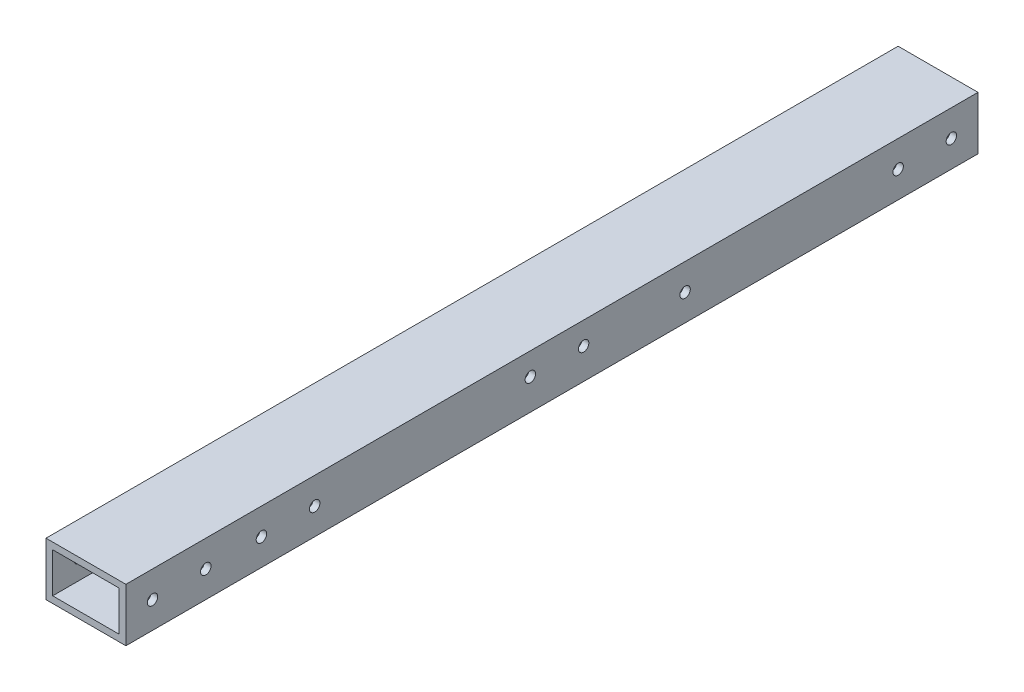
ISO-10303-21;
HEADER;
FILE_DESCRIPTION(('STEP AP214'),'2;1');
FILE_NAME('part.step','',(''),(''),'','','');
FILE_SCHEMA(('AUTOMOTIVE_DESIGN { 1 0 10303 214 1 1 1 1 }'));
ENDSEC;
DATA;
#1=APPLICATION_CONTEXT('core data for automotive mechanical design processes');
#2=APPLICATION_PROTOCOL_DEFINITION('international standard','automotive_design',2000,#1);
#3=PRODUCT_CONTEXT('',#1,'mechanical');
#4=PRODUCT('Part','Part','',(#3));
#5=PRODUCT_RELATED_PRODUCT_CATEGORY('part','',(#4));
#6=PRODUCT_DEFINITION_FORMATION('','',#4);
#7=PRODUCT_DEFINITION_CONTEXT('part definition',#1,'design');
#8=PRODUCT_DEFINITION('design','',#6,#7);
#9=PRODUCT_DEFINITION_SHAPE('','',#8);
#10=(LENGTH_UNIT() NAMED_UNIT(*) SI_UNIT(.MILLI.,.METRE.));
#11=(NAMED_UNIT(*) PLANE_ANGLE_UNIT() SI_UNIT($,.RADIAN.));
#12=(NAMED_UNIT(*) SI_UNIT($,.STERADIAN.) SOLID_ANGLE_UNIT());
#13=UNCERTAINTY_MEASURE_WITH_UNIT(LENGTH_MEASURE(1.E-05),#10,'distance_accuracy_value','');
#14=(GEOMETRIC_REPRESENTATION_CONTEXT(3) GLOBAL_UNCERTAINTY_ASSIGNED_CONTEXT((#13)) GLOBAL_UNIT_ASSIGNED_CONTEXT((#10,
#11,#12)) REPRESENTATION_CONTEXT('',''));
#15=CARTESIAN_POINT('',(0.,0.,0.));
#16=DIRECTION('',(0.,0.,1.));
#17=DIRECTION('',(1.,0.,0.));
#18=AXIS2_PLACEMENT_3D('',#15,#16,#17);
#19=CARTESIAN_POINT('',(-19.05,12.7,317.499999492));
#20=DIRECTION('',(1.,0.,0.));
#21=DIRECTION('',(0.,0.,-1.));
#22=AXIS2_PLACEMENT_3D('',#19,#20,#21);
#23=PLANE('',#22);
#24=CARTESIAN_POINT('',(-19.05,0.,-76.2));
#25=DIRECTION('',(-1.,0.,0.));
#26=DIRECTION('',(0.,0.,1.));
#27=AXIS2_PLACEMENT_3D('',#24,#25,#26);
#28=CIRCLE('',#27,2.4892);
#29=CARTESIAN_POINT('',(-19.05,0.,-73.7108));
#30=VERTEX_POINT('',#29);
#31=EDGE_CURVE('E314',#30,#30,#28,.T.);
#32=ORIENTED_EDGE('',*,*,#31,.F.);
#33=EDGE_LOOP('',(#32));
#34=FACE_BOUND('',#33,.T.);
#35=CARTESIAN_POINT('',(-19.05,0.,304.799999492));
#36=DIRECTION('',(-1.,0.,0.));
#37=DIRECTION('',(0.,0.,1.));
#38=AXIS2_PLACEMENT_3D('',#35,#36,#37);
#39=CIRCLE('',#38,2.4892);
#40=CARTESIAN_POINT('',(-19.05,0.,307.289199492));
#41=VERTEX_POINT('',#40);
#42=EDGE_CURVE('E304',#41,#41,#39,.T.);
#43=ORIENTED_EDGE('',*,*,#42,.F.);
#44=EDGE_LOOP('',(#43));
#45=FACE_BOUND('',#44,.T.);
#46=CARTESIAN_POINT('',(-19.05,0.,279.399999492));
#47=DIRECTION('',(-1.,0.,0.));
#48=DIRECTION('',(0.,0.,1.));
#49=AXIS2_PLACEMENT_3D('',#46,#47,#48);
#50=CIRCLE('',#49,2.4892);
#51=CARTESIAN_POINT('',(-19.05,0.,281.889199492));
#52=VERTEX_POINT('',#51);
#53=EDGE_CURVE('E294',#52,#52,#50,.T.);
#54=ORIENTED_EDGE('',*,*,#53,.F.);
#55=EDGE_LOOP('',(#54));
#56=FACE_BOUND('',#55,.T.);
#57=CARTESIAN_POINT('',(-19.05,1.94340482146555,99.1870005067131));
#58=DIRECTION('',(1.,0.,0.));
#59=DIRECTION('',(0.,0.,-1.));
#60=AXIS2_PLACEMENT_3D('',#57,#58,#59);
#61=CIRCLE('',#60,2.48919999999999);
#62=CARTESIAN_POINT('',(-19.05,1.94340482146555,96.6978005067131));
#63=VERTEX_POINT('',#62);
#64=EDGE_CURVE('E199',#63,#63,#61,.T.);
#65=ORIENTED_EDGE('',*,*,#64,.T.);
#66=EDGE_LOOP('',(#65));
#67=FACE_BOUND('',#66,.T.);
#68=CARTESIAN_POINT('',(-19.05,1.94340481842892,124.587000506713));
#69=DIRECTION('',(1.,0.,0.));
#70=DIRECTION('',(0.,0.,-1.));
#71=AXIS2_PLACEMENT_3D('',#68,#69,#70);
#72=CIRCLE('',#71,2.48919999999999);
#73=CARTESIAN_POINT('',(-19.05,1.94340481842892,122.097800506713));
#74=VERTEX_POINT('',#73);
#75=EDGE_CURVE('E205',#74,#74,#72,.T.);
#76=ORIENTED_EDGE('',*,*,#75,.T.);
#77=EDGE_LOOP('',(#76));
#78=FACE_BOUND('',#77,.T.);
#79=CARTESIAN_POINT('',(-19.05,1.0763115225465E-08,227.45700050648));
#80=DIRECTION('',(1.,0.,0.));
#81=DIRECTION('',(0.,0.,-1.));
#82=AXIS2_PLACEMENT_3D('',#79,#80,#81);
#83=CIRCLE('',#82,2.48919999999999);
#84=CARTESIAN_POINT('',(-19.05,1.0763115225465E-08,224.967800506481));
#85=VERTEX_POINT('',#84);
#86=EDGE_CURVE('E211',#85,#85,#83,.T.);
#87=ORIENTED_EDGE('',*,*,#86,.T.);
#88=EDGE_LOOP('',(#87));
#89=FACE_BOUND('',#88,.T.);
#90=CARTESIAN_POINT('',(-19.05,7.72651647523714E-09,252.85700050648));
#91=DIRECTION('',(1.,0.,0.));
#92=DIRECTION('',(0.,0.,-1.));
#93=AXIS2_PLACEMENT_3D('',#90,#91,#92);
#94=CIRCLE('',#93,2.48919999999999);
#95=CARTESIAN_POINT('',(-19.05,7.72651647523714E-09,250.367800506481));
#96=VERTEX_POINT('',#95);
#97=EDGE_CURVE('E217',#96,#96,#94,.T.);
#98=ORIENTED_EDGE('',*,*,#97,.T.);
#99=EDGE_LOOP('',(#98));
#100=FACE_BOUND('',#99,.T.);
#101=CARTESIAN_POINT('',(-19.05,0.,50.8));
#102=DIRECTION('',(-1.,0.,0.));
#103=DIRECTION('',(0.,0.,1.));
#104=AXIS2_PLACEMENT_3D('',#101,#102,#103);
#105=CIRCLE('',#104,2.48919999999999);
#106=CARTESIAN_POINT('',(-19.05,0.,53.2892));
#107=VERTEX_POINT('',#106);
#108=EDGE_CURVE('E233',#107,#107,#105,.T.);
#109=ORIENTED_EDGE('',*,*,#108,.F.);
#110=EDGE_LOOP('',(#109));
#111=FACE_BOUND('',#110,.T.);
#112=CARTESIAN_POINT('',(-19.05,0.,-50.8));
#113=DIRECTION('',(-1.,0.,0.));
#114=DIRECTION('',(0.,0.,1.));
#115=AXIS2_PLACEMENT_3D('',#112,#113,#114);
#116=CIRCLE('',#115,2.48919999999999);
#117=CARTESIAN_POINT('',(-19.05,0.,-48.3108));
#118=VERTEX_POINT('',#117);
#119=EDGE_CURVE('E236',#118,#118,#116,.T.);
#120=ORIENTED_EDGE('',*,*,#119,.F.);
#121=EDGE_LOOP('',(#120));
#122=FACE_BOUND('',#121,.T.);
#123=DIRECTION('',(0.,1.,0.));
#124=VECTOR('',#123,1.);
#125=CARTESIAN_POINT('',(-19.05,12.7,-88.899999492));
#126=LINE('',#125,#124);
#127=CARTESIAN_POINT('',(-19.05,-12.7,-88.899999492));
#128=VERTEX_POINT('',#127);
#129=CARTESIAN_POINT('',(-19.05,12.7,-88.899999492));
#130=VERTEX_POINT('',#129);
#131=EDGE_CURVE('E60',#128,#130,#126,.T.);
#132=ORIENTED_EDGE('',*,*,#131,.F.);
#133=DIRECTION('',(0.,0.,-1.));
#134=VECTOR('',#133,1.);
#135=CARTESIAN_POINT('',(-19.05,-12.7,317.499999492));
#136=LINE('',#135,#134);
#137=CARTESIAN_POINT('',(-19.05,-12.7,317.499999492));
#138=VERTEX_POINT('',#137);
#139=EDGE_CURVE('E53',#138,#128,#136,.T.);
#140=ORIENTED_EDGE('',*,*,#139,.F.);
#141=DIRECTION('',(0.,-1.,0.));
#142=VECTOR('',#141,1.);
#143=CARTESIAN_POINT('',(-19.05,12.7,317.499999492));
#144=LINE('',#143,#142);
#145=CARTESIAN_POINT('',(-19.05,12.7,317.499999492));
#146=VERTEX_POINT('',#145);
#147=EDGE_CURVE('E152',#146,#138,#144,.T.);
#148=ORIENTED_EDGE('',*,*,#147,.F.);
#149=DIRECTION('',(0.,0.,-1.));
#150=VECTOR('',#149,1.);
#151=CARTESIAN_POINT('',(-19.05,12.7,317.499999492));
#152=LINE('',#151,#150);
#153=EDGE_CURVE('E165',#146,#130,#152,.T.);
#154=ORIENTED_EDGE('',*,*,#153,.T.);
#155=EDGE_LOOP('',(#132,#140,#148,#154));
#156=FACE_BOUND('',#155,.T.);
#157=ADVANCED_FACE('F45',(#34,#45,#56,#67,#78,#89,#100,#111,#122,#156),#23,.F.);
#158=CARTESIAN_POINT('',(-19.05,-12.7,317.499999492));
#159=DIRECTION('',(0.,1.,0.));
#160=DIRECTION('',(0.,0.,1.));
#161=AXIS2_PLACEMENT_3D('',#158,#159,#160);
#162=PLANE('',#161);
#163=DIRECTION('',(-1.,0.,0.));
#164=VECTOR('',#163,1.);
#165=CARTESIAN_POINT('',(-19.05,-12.7,-88.899999492));
#166=LINE('',#165,#164);
#167=CARTESIAN_POINT('',(19.05,-12.7,-88.899999492));
#168=VERTEX_POINT('',#167);
#169=EDGE_CURVE('E67',#168,#128,#166,.T.);
#170=ORIENTED_EDGE('',*,*,#169,.F.);
#171=DIRECTION('',(0.,0.,-1.));
#172=VECTOR('',#171,1.);
#173=CARTESIAN_POINT('',(19.05,-12.7,317.499999492));
#174=LINE('',#173,#172);
#175=CARTESIAN_POINT('',(19.05,-12.7,317.499999492));
#176=VERTEX_POINT('',#175);
#177=EDGE_CURVE('E171',#176,#168,#174,.T.);
#178=ORIENTED_EDGE('',*,*,#177,.F.);
#179=DIRECTION('',(1.,0.,0.));
#180=VECTOR('',#179,1.);
#181=CARTESIAN_POINT('',(-19.05,-12.7,317.499999492));
#182=LINE('',#181,#180);
#183=EDGE_CURVE('E156',#138,#176,#182,.T.);
#184=ORIENTED_EDGE('',*,*,#183,.F.);
#185=ORIENTED_EDGE('',*,*,#139,.T.);
#186=EDGE_LOOP('',(#170,#178,#184,#185));
#187=FACE_BOUND('',#186,.T.);
#188=ADVANCED_FACE('F360',(#187),#162,.F.);
#189=CARTESIAN_POINT('',(19.05,-12.7,317.499999492));
#190=DIRECTION('',(-1.,0.,0.));
#191=DIRECTION('',(0.,-1.,0.));
#192=AXIS2_PLACEMENT_3D('',#189,#190,#191);
#193=PLANE('',#192);
#194=CARTESIAN_POINT('',(19.05,0.,-76.2));
#195=DIRECTION('',(-1.,0.,0.));
#196=DIRECTION('',(0.,0.,1.));
#197=AXIS2_PLACEMENT_3D('',#194,#195,#196);
#198=CIRCLE('',#197,2.48919999999999);
#199=CARTESIAN_POINT('',(19.05,0.,-73.7108));
#200=VERTEX_POINT('',#199);
#201=EDGE_CURVE('E181',#200,#200,#198,.T.);
#202=ORIENTED_EDGE('',*,*,#201,.T.);
#203=EDGE_LOOP('',(#202));
#204=FACE_BOUND('',#203,.T.);
#205=CARTESIAN_POINT('',(19.05,0.,304.799999492));
#206=DIRECTION('',(-1.,0.,0.));
#207=DIRECTION('',(0.,0.,1.));
#208=AXIS2_PLACEMENT_3D('',#205,#206,#207);
#209=CIRCLE('',#208,2.48919999999999);
#210=CARTESIAN_POINT('',(19.05,0.,307.289199492));
#211=VERTEX_POINT('',#210);
#212=EDGE_CURVE('E187',#211,#211,#209,.T.);
#213=ORIENTED_EDGE('',*,*,#212,.T.);
#214=EDGE_LOOP('',(#213));
#215=FACE_BOUND('',#214,.T.);
#216=CARTESIAN_POINT('',(19.05,0.,279.399999492));
#217=DIRECTION('',(-1.,0.,0.));
#218=DIRECTION('',(0.,0.,1.));
#219=AXIS2_PLACEMENT_3D('',#216,#217,#218);
#220=CIRCLE('',#219,2.48919999999999);
#221=CARTESIAN_POINT('',(19.05,0.,281.889199492));
#222=VERTEX_POINT('',#221);
#223=EDGE_CURVE('E193',#222,#222,#220,.T.);
#224=ORIENTED_EDGE('',*,*,#223,.T.);
#225=EDGE_LOOP('',(#224));
#226=FACE_BOUND('',#225,.T.);
#227=CARTESIAN_POINT('',(19.05,1.94340482146555,99.1870005067131));
#228=DIRECTION('',(1.,0.,0.));
#229=DIRECTION('',(0.,0.,-1.));
#230=AXIS2_PLACEMENT_3D('',#227,#228,#229);
#231=CIRCLE('',#230,2.4892);
#232=CARTESIAN_POINT('',(19.05,1.94340482146555,96.6978005067131));
#233=VERTEX_POINT('',#232);
#234=EDGE_CURVE('E284',#233,#233,#231,.T.);
#235=ORIENTED_EDGE('',*,*,#234,.F.);
#236=EDGE_LOOP('',(#235));
#237=FACE_BOUND('',#236,.T.);
#238=CARTESIAN_POINT('',(19.05,1.94340481842892,124.587000506713));
#239=DIRECTION('',(1.,0.,0.));
#240=DIRECTION('',(0.,0.,-1.));
#241=AXIS2_PLACEMENT_3D('',#238,#239,#240);
#242=CIRCLE('',#241,2.4892);
#243=CARTESIAN_POINT('',(19.05,1.94340481842892,122.097800506713));
#244=VERTEX_POINT('',#243);
#245=EDGE_CURVE('E274',#244,#244,#242,.T.);
#246=ORIENTED_EDGE('',*,*,#245,.F.);
#247=EDGE_LOOP('',(#246));
#248=FACE_BOUND('',#247,.T.);
#249=CARTESIAN_POINT('',(19.05,1.0763115225465E-08,227.45700050648));
#250=DIRECTION('',(1.,0.,0.));
#251=DIRECTION('',(0.,0.,-1.));
#252=AXIS2_PLACEMENT_3D('',#249,#250,#251);
#253=CIRCLE('',#252,2.4892);
#254=CARTESIAN_POINT('',(19.05,1.0763115225465E-08,224.967800506481));
#255=VERTEX_POINT('',#254);
#256=EDGE_CURVE('E264',#255,#255,#253,.T.);
#257=ORIENTED_EDGE('',*,*,#256,.F.);
#258=EDGE_LOOP('',(#257));
#259=FACE_BOUND('',#258,.T.);
#260=CARTESIAN_POINT('',(19.05,7.72651647523714E-09,252.85700050648));
#261=DIRECTION('',(1.,0.,0.));
#262=DIRECTION('',(0.,0.,-1.));
#263=AXIS2_PLACEMENT_3D('',#260,#261,#262);
#264=CIRCLE('',#263,2.4892);
#265=CARTESIAN_POINT('',(19.05,7.72651647523714E-09,250.367800506481));
#266=VERTEX_POINT('',#265);
#267=EDGE_CURVE('E254',#266,#266,#264,.T.);
#268=ORIENTED_EDGE('',*,*,#267,.F.);
#269=EDGE_LOOP('',(#268));
#270=FACE_BOUND('',#269,.T.);
#271=CARTESIAN_POINT('',(19.05,0.,50.8));
#272=DIRECTION('',(-1.,0.,0.));
#273=DIRECTION('',(0.,0.,1.));
#274=AXIS2_PLACEMENT_3D('',#271,#272,#273);
#275=CIRCLE('',#274,2.48919999999998);
#276=CARTESIAN_POINT('',(19.05,0.,53.2892));
#277=VERTEX_POINT('',#276);
#278=EDGE_CURVE('E222',#277,#277,#275,.T.);
#279=ORIENTED_EDGE('',*,*,#278,.T.);
#280=EDGE_LOOP('',(#279));
#281=FACE_BOUND('',#280,.T.);
#282=CARTESIAN_POINT('',(19.05,0.,-50.8));
#283=DIRECTION('',(-1.,0.,0.));
#284=DIRECTION('',(0.,0.,1.));
#285=AXIS2_PLACEMENT_3D('',#282,#283,#284);
#286=CIRCLE('',#285,2.48919999999998);
#287=CARTESIAN_POINT('',(19.05,0.,-48.3108));
#288=VERTEX_POINT('',#287);
#289=EDGE_CURVE('E227',#288,#288,#286,.T.);
#290=ORIENTED_EDGE('',*,*,#289,.T.);
#291=EDGE_LOOP('',(#290));
#292=FACE_BOUND('',#291,.T.);
#293=DIRECTION('',(0.,-1.,0.));
#294=VECTOR('',#293,1.);
#295=CARTESIAN_POINT('',(19.05,-12.7,-88.899999492));
#296=LINE('',#295,#294);
#297=CARTESIAN_POINT('',(19.05,12.7,-88.899999492));
#298=VERTEX_POINT('',#297);
#299=EDGE_CURVE('E348',#298,#168,#296,.T.);
#300=ORIENTED_EDGE('',*,*,#299,.F.);
#301=DIRECTION('',(0.,0.,-1.));
#302=VECTOR('',#301,1.);
#303=CARTESIAN_POINT('',(19.05,12.7,317.499999492));
#304=LINE('',#303,#302);
#305=CARTESIAN_POINT('',(19.05,12.7,317.499999492));
#306=VERTEX_POINT('',#305);
#307=EDGE_CURVE('E168',#306,#298,#304,.T.);
#308=ORIENTED_EDGE('',*,*,#307,.F.);
#309=DIRECTION('',(0.,1.,0.));
#310=VECTOR('',#309,1.);
#311=CARTESIAN_POINT('',(19.05,-12.7,317.499999492));
#312=LINE('',#311,#310);
#313=EDGE_CURVE('E159',#176,#306,#312,.T.);
#314=ORIENTED_EDGE('',*,*,#313,.F.);
#315=ORIENTED_EDGE('',*,*,#177,.T.);
#316=EDGE_LOOP('',(#300,#308,#314,#315));
#317=FACE_BOUND('',#316,.T.);
#318=ADVANCED_FACE('F357',(#204,#215,#226,#237,#248,#259,#270,#281,#292,#317),#193,.F.);
#319=CARTESIAN_POINT('',(19.05,12.7,317.499999492));
#320=DIRECTION('',(0.,-1.,0.));
#321=DIRECTION('',(0.,0.,-1.));
#322=AXIS2_PLACEMENT_3D('',#319,#320,#321);
#323=PLANE('',#322);
#324=DIRECTION('',(1.,0.,0.));
#325=VECTOR('',#324,1.);
#326=CARTESIAN_POINT('',(19.05,12.7,-88.899999492));
#327=LINE('',#326,#325);
#328=EDGE_CURVE('E130',#130,#298,#327,.T.);
#329=ORIENTED_EDGE('',*,*,#328,.F.);
#330=ORIENTED_EDGE('',*,*,#153,.F.);
#331=DIRECTION('',(-1.,0.,0.));
#332=VECTOR('',#331,1.);
#333=CARTESIAN_POINT('',(19.05,12.7,317.499999492));
#334=LINE('',#333,#332);
#335=EDGE_CURVE('E162',#306,#146,#334,.T.);
#336=ORIENTED_EDGE('',*,*,#335,.F.);
#337=ORIENTED_EDGE('',*,*,#307,.T.);
#338=EDGE_LOOP('',(#329,#330,#336,#337));
#339=FACE_BOUND('',#338,.T.);
#340=ADVANCED_FACE('F448',(#339),#323,.F.);
#341=CARTESIAN_POINT('',(-15.875,9.525,317.499999492));
#342=DIRECTION('',(1.,0.,0.));
#343=DIRECTION('',(0.,1.,0.));
#344=AXIS2_PLACEMENT_3D('',#341,#342,#343);
#345=PLANE('',#344);
#346=CARTESIAN_POINT('',(-15.875,0.,-50.8));
#347=DIRECTION('',(1.,0.,0.));
#348=DIRECTION('',(0.,1.,0.));
#349=AXIS2_PLACEMENT_3D('',#346,#347,#348);
#350=CIRCLE('',#349,2.48919999999999);
#351=CARTESIAN_POINT('',(-15.875,2.48919999999998,-50.8));
#352=VERTEX_POINT('',#351);
#353=EDGE_CURVE('E223',#352,#352,#350,.T.);
#354=ORIENTED_EDGE('',*,*,#353,.F.);
#355=EDGE_LOOP('',(#354));
#356=FACE_BOUND('',#355,.T.);
#357=CARTESIAN_POINT('',(-15.875,0.,50.8));
#358=DIRECTION('',(1.,0.,0.));
#359=DIRECTION('',(0.,1.,0.));
#360=AXIS2_PLACEMENT_3D('',#357,#358,#359);
#361=CIRCLE('',#360,2.48919999999999);
#362=CARTESIAN_POINT('',(-15.875,2.48919999999999,50.8));
#363=VERTEX_POINT('',#362);
#364=EDGE_CURVE('E221',#363,#363,#361,.T.);
#365=ORIENTED_EDGE('',*,*,#364,.F.);
#366=EDGE_LOOP('',(#365));
#367=FACE_BOUND('',#366,.T.);
#368=CARTESIAN_POINT('',(-15.875,7.72651647523714E-09,252.85700050648));
#369=DIRECTION('',(1.,0.,0.));
#370=DIRECTION('',(0.,1.,0.));
#371=AXIS2_PLACEMENT_3D('',#368,#369,#370);
#372=CIRCLE('',#371,2.48919999999999);
#373=CARTESIAN_POINT('',(-15.875,2.48920000772651,252.85700050648));
#374=VERTEX_POINT('',#373);
#375=EDGE_CURVE('E216',#374,#374,#372,.T.);
#376=ORIENTED_EDGE('',*,*,#375,.F.);
#377=EDGE_LOOP('',(#376));
#378=FACE_BOUND('',#377,.T.);
#379=CARTESIAN_POINT('',(-15.875,1.0763115225465E-08,227.45700050648));
#380=DIRECTION('',(1.,0.,0.));
#381=DIRECTION('',(0.,1.,0.));
#382=AXIS2_PLACEMENT_3D('',#379,#380,#381);
#383=CIRCLE('',#382,2.48919999999999);
#384=CARTESIAN_POINT('',(-15.875,2.48920001076311,227.45700050648));
#385=VERTEX_POINT('',#384);
#386=EDGE_CURVE('E210',#385,#385,#383,.T.);
#387=ORIENTED_EDGE('',*,*,#386,.F.);
#388=EDGE_LOOP('',(#387));
#389=FACE_BOUND('',#388,.T.);
#390=CARTESIAN_POINT('',(-15.875,1.94340481842892,124.587000506713));
#391=DIRECTION('',(1.,0.,0.));
#392=DIRECTION('',(0.,1.,0.));
#393=AXIS2_PLACEMENT_3D('',#390,#391,#392);
#394=CIRCLE('',#393,2.48919999999999);
#395=CARTESIAN_POINT('',(-15.875,4.43260481842891,124.587000506713));
#396=VERTEX_POINT('',#395);
#397=EDGE_CURVE('E204',#396,#396,#394,.T.);
#398=ORIENTED_EDGE('',*,*,#397,.F.);
#399=EDGE_LOOP('',(#398));
#400=FACE_BOUND('',#399,.T.);
#401=CARTESIAN_POINT('',(-15.875,1.94340482146555,99.1870005067131));
#402=DIRECTION('',(1.,0.,0.));
#403=DIRECTION('',(0.,1.,0.));
#404=AXIS2_PLACEMENT_3D('',#401,#402,#403);
#405=CIRCLE('',#404,2.48919999999999);
#406=CARTESIAN_POINT('',(-15.875,4.43260482146554,99.1870005067131));
#407=VERTEX_POINT('',#406);
#408=EDGE_CURVE('E198',#407,#407,#405,.T.);
#409=ORIENTED_EDGE('',*,*,#408,.F.);
#410=EDGE_LOOP('',(#409));
#411=FACE_BOUND('',#410,.T.);
#412=CARTESIAN_POINT('',(-15.875,0.,279.399999492));
#413=DIRECTION('',(1.,0.,0.));
#414=DIRECTION('',(0.,1.,0.));
#415=AXIS2_PLACEMENT_3D('',#412,#413,#414);
#416=CIRCLE('',#415,2.48919999999999);
#417=CARTESIAN_POINT('',(-15.875,2.48919999999999,279.399999492));
#418=VERTEX_POINT('',#417);
#419=EDGE_CURVE('E188',#418,#418,#416,.T.);
#420=ORIENTED_EDGE('',*,*,#419,.F.);
#421=EDGE_LOOP('',(#420));
#422=FACE_BOUND('',#421,.T.);
#423=CARTESIAN_POINT('',(-15.875,0.,304.799999492));
#424=DIRECTION('',(1.,0.,0.));
#425=DIRECTION('',(0.,1.,0.));
#426=AXIS2_PLACEMENT_3D('',#423,#424,#425);
#427=CIRCLE('',#426,2.48919999999999);
#428=CARTESIAN_POINT('',(-15.875,2.48919999999999,304.799999492));
#429=VERTEX_POINT('',#428);
#430=EDGE_CURVE('E186',#429,#429,#427,.T.);
#431=ORIENTED_EDGE('',*,*,#430,.F.);
#432=EDGE_LOOP('',(#431));
#433=FACE_BOUND('',#432,.T.);
#434=CARTESIAN_POINT('',(-15.875,0.,-76.2));
#435=DIRECTION('',(1.,0.,0.));
#436=DIRECTION('',(0.,1.,0.));
#437=AXIS2_PLACEMENT_3D('',#434,#435,#436);
#438=CIRCLE('',#437,2.48919999999999);
#439=CARTESIAN_POINT('',(-15.875,2.48919999999999,-76.2));
#440=VERTEX_POINT('',#439);
#441=EDGE_CURVE('E180',#440,#440,#438,.T.);
#442=ORIENTED_EDGE('',*,*,#441,.F.);
#443=EDGE_LOOP('',(#442));
#444=FACE_BOUND('',#443,.T.);
#445=DIRECTION('',(0.,0.,-1.));
#446=VECTOR('',#445,1.);
#447=CARTESIAN_POINT('',(-15.875,-9.525,317.499999492));
#448=LINE('',#447,#446);
#449=CARTESIAN_POINT('',(-15.875,-9.525,317.499999492));
#450=VERTEX_POINT('',#449);
#451=CARTESIAN_POINT('',(-15.875,-9.525,-88.899999492));
#452=VERTEX_POINT('',#451);
#453=EDGE_CURVE('E128',#450,#452,#448,.T.);
#454=ORIENTED_EDGE('',*,*,#453,.T.);
#455=DIRECTION('',(0.,1.,0.));
#456=VECTOR('',#455,1.);
#457=CARTESIAN_POINT('',(-15.875,9.525,-88.899999492));
#458=LINE('',#457,#456);
#459=CARTESIAN_POINT('',(-15.875,9.525,-88.899999492));
#460=VERTEX_POINT('',#459);
#461=EDGE_CURVE('E114',#452,#460,#458,.T.);
#462=ORIENTED_EDGE('',*,*,#461,.T.);
#463=DIRECTION('',(0.,0.,-1.));
#464=VECTOR('',#463,1.);
#465=CARTESIAN_POINT('',(-15.875,9.525,317.499999492));
#466=LINE('',#465,#464);
#467=CARTESIAN_POINT('',(-15.875,9.525,317.499999492));
#468=VERTEX_POINT('',#467);
#469=EDGE_CURVE('E125',#468,#460,#466,.T.);
#470=ORIENTED_EDGE('',*,*,#469,.F.);
#471=DIRECTION('',(0.,-1.,0.));
#472=VECTOR('',#471,1.);
#473=CARTESIAN_POINT('',(-15.875,9.525,317.499999492));
#474=LINE('',#473,#472);
#475=EDGE_CURVE('E324',#468,#450,#474,.T.);
#476=ORIENTED_EDGE('',*,*,#475,.T.);
#477=EDGE_LOOP('',(#454,#462,#470,#476));
#478=FACE_BOUND('',#477,.T.);
#479=ADVANCED_FACE('F124',(#356,#367,#378,#389,#400,#411,#422,#433,#444,#478),#345,.T.);
#480=CARTESIAN_POINT('',(-15.875,-9.525,317.499999492));
#481=DIRECTION('',(0.,1.,0.));
#482=DIRECTION('',(0.,0.,1.));
#483=AXIS2_PLACEMENT_3D('',#480,#481,#482);
#484=PLANE('',#483);
#485=DIRECTION('',(0.,0.,-1.));
#486=VECTOR('',#485,1.);
#487=CARTESIAN_POINT('',(15.875,-9.525,317.499999492));
#488=LINE('',#487,#486);
#489=CARTESIAN_POINT('',(15.875,-9.525,317.499999492));
#490=VERTEX_POINT('',#489);
#491=CARTESIAN_POINT('',(15.875,-9.525,-88.899999492));
#492=VERTEX_POINT('',#491);
#493=EDGE_CURVE('E141',#490,#492,#488,.T.);
#494=ORIENTED_EDGE('',*,*,#493,.T.);
#495=DIRECTION('',(-1.,0.,0.));
#496=VECTOR('',#495,1.);
#497=CARTESIAN_POINT('',(-15.875,-9.525,-88.899999492));
#498=LINE('',#497,#496);
#499=EDGE_CURVE('E131',#492,#452,#498,.T.);
#500=ORIENTED_EDGE('',*,*,#499,.T.);
#501=ORIENTED_EDGE('',*,*,#453,.F.);
#502=DIRECTION('',(1.,0.,0.));
#503=VECTOR('',#502,1.);
#504=CARTESIAN_POINT('',(-15.875,-9.525,317.499999492));
#505=LINE('',#504,#503);
#506=EDGE_CURVE('E327',#450,#490,#505,.T.);
#507=ORIENTED_EDGE('',*,*,#506,.T.);
#508=EDGE_LOOP('',(#494,#500,#501,#507));
#509=FACE_BOUND('',#508,.T.);
#510=ADVANCED_FACE('F339',(#509),#484,.T.);
#511=CARTESIAN_POINT('',(15.875,-9.525,317.499999492));
#512=DIRECTION('',(-1.,0.,0.));
#513=DIRECTION('',(0.,-1.,0.));
#514=AXIS2_PLACEMENT_3D('',#511,#512,#513);
#515=PLANE('',#514);
#516=CARTESIAN_POINT('',(15.875,0.,-50.8));
#517=DIRECTION('',(-1.,0.,0.));
#518=DIRECTION('',(0.,-1.,0.));
#519=AXIS2_PLACEMENT_3D('',#516,#517,#518);
#520=CIRCLE('',#519,2.48919999999999);
#521=CARTESIAN_POINT('',(15.875,-2.48919999999999,-50.8));
#522=VERTEX_POINT('',#521);
#523=EDGE_CURVE('E226',#522,#522,#520,.T.);
#524=ORIENTED_EDGE('',*,*,#523,.F.);
#525=EDGE_LOOP('',(#524));
#526=FACE_BOUND('',#525,.T.);
#527=CARTESIAN_POINT('',(15.875,0.,50.8));
#528=DIRECTION('',(-1.,0.,0.));
#529=DIRECTION('',(0.,-1.,0.));
#530=AXIS2_PLACEMENT_3D('',#527,#528,#529);
#531=CIRCLE('',#530,2.48919999999999);
#532=CARTESIAN_POINT('',(15.875,-2.48919999999999,50.8));
#533=VERTEX_POINT('',#532);
#534=EDGE_CURVE('E218',#533,#533,#531,.T.);
#535=ORIENTED_EDGE('',*,*,#534,.F.);
#536=EDGE_LOOP('',(#535));
#537=FACE_BOUND('',#536,.T.);
#538=CARTESIAN_POINT('',(15.875,7.72651647523714E-09,252.85700050648));
#539=DIRECTION('',(-1.,0.,0.));
#540=DIRECTION('',(0.,-1.,0.));
#541=AXIS2_PLACEMENT_3D('',#538,#539,#540);
#542=CIRCLE('',#541,2.48919999999999);
#543=CARTESIAN_POINT('',(15.875,-2.48919999227348,252.85700050648));
#544=VERTEX_POINT('',#543);
#545=EDGE_CURVE('E212',#544,#544,#542,.T.);
#546=ORIENTED_EDGE('',*,*,#545,.F.);
#547=EDGE_LOOP('',(#546));
#548=FACE_BOUND('',#547,.T.);
#549=CARTESIAN_POINT('',(15.875,1.0763115225465E-08,227.45700050648));
#550=DIRECTION('',(-1.,0.,0.));
#551=DIRECTION('',(0.,-1.,0.));
#552=AXIS2_PLACEMENT_3D('',#549,#550,#551);
#553=CIRCLE('',#552,2.48919999999999);
#554=CARTESIAN_POINT('',(15.875,-2.48919998923688,227.45700050648));
#555=VERTEX_POINT('',#554);
#556=EDGE_CURVE('E206',#555,#555,#553,.T.);
#557=ORIENTED_EDGE('',*,*,#556,.F.);
#558=EDGE_LOOP('',(#557));
#559=FACE_BOUND('',#558,.T.);
#560=CARTESIAN_POINT('',(15.875,1.94340481842892,124.587000506713));
#561=DIRECTION('',(-1.,0.,0.));
#562=DIRECTION('',(0.,-1.,0.));
#563=AXIS2_PLACEMENT_3D('',#560,#561,#562);
#564=CIRCLE('',#563,2.48919999999999);
#565=CARTESIAN_POINT('',(15.875,-0.545795181571073,124.587000506713));
#566=VERTEX_POINT('',#565);
#567=EDGE_CURVE('E200',#566,#566,#564,.T.);
#568=ORIENTED_EDGE('',*,*,#567,.F.);
#569=EDGE_LOOP('',(#568));
#570=FACE_BOUND('',#569,.T.);
#571=CARTESIAN_POINT('',(15.875,1.94340482146555,99.1870005067131));
#572=DIRECTION('',(-1.,0.,0.));
#573=DIRECTION('',(0.,-1.,0.));
#574=AXIS2_PLACEMENT_3D('',#571,#572,#573);
#575=CIRCLE('',#574,2.48919999999999);
#576=CARTESIAN_POINT('',(15.875,-0.545795178534447,99.1870005067131));
#577=VERTEX_POINT('',#576);
#578=EDGE_CURVE('E194',#577,#577,#575,.T.);
#579=ORIENTED_EDGE('',*,*,#578,.F.);
#580=EDGE_LOOP('',(#579));
#581=FACE_BOUND('',#580,.T.);
#582=CARTESIAN_POINT('',(15.875,0.,279.399999492));
#583=DIRECTION('',(-1.,0.,0.));
#584=DIRECTION('',(0.,-1.,0.));
#585=AXIS2_PLACEMENT_3D('',#582,#583,#584);
#586=CIRCLE('',#585,2.48919999999999);
#587=CARTESIAN_POINT('',(15.875,-2.4892,279.399999492));
#588=VERTEX_POINT('',#587);
#589=EDGE_CURVE('E192',#588,#588,#586,.T.);
#590=ORIENTED_EDGE('',*,*,#589,.F.);
#591=EDGE_LOOP('',(#590));
#592=FACE_BOUND('',#591,.T.);
#593=CARTESIAN_POINT('',(15.875,0.,304.799999492));
#594=DIRECTION('',(-1.,0.,0.));
#595=DIRECTION('',(0.,-1.,0.));
#596=AXIS2_PLACEMENT_3D('',#593,#594,#595);
#597=CIRCLE('',#596,2.48919999999999);
#598=CARTESIAN_POINT('',(15.875,-2.4892,304.799999492));
#599=VERTEX_POINT('',#598);
#600=EDGE_CURVE('E182',#599,#599,#597,.T.);
#601=ORIENTED_EDGE('',*,*,#600,.F.);
#602=EDGE_LOOP('',(#601));
#603=FACE_BOUND('',#602,.T.);
#604=CARTESIAN_POINT('',(15.875,0.,-76.2));
#605=DIRECTION('',(-1.,0.,0.));
#606=DIRECTION('',(0.,-1.,0.));
#607=AXIS2_PLACEMENT_3D('',#604,#605,#606);
#608=CIRCLE('',#607,2.48919999999999);
#609=CARTESIAN_POINT('',(15.875,-2.4892,-76.2));
#610=VERTEX_POINT('',#609);
#611=EDGE_CURVE('E176',#610,#610,#608,.T.);
#612=ORIENTED_EDGE('',*,*,#611,.F.);
#613=EDGE_LOOP('',(#612));
#614=FACE_BOUND('',#613,.T.);
#615=DIRECTION('',(0.,0.,-1.));
#616=VECTOR('',#615,1.);
#617=CARTESIAN_POINT('',(15.875,9.525,317.499999492));
#618=LINE('',#617,#616);
#619=CARTESIAN_POINT('',(15.875,9.525,317.499999492));
#620=VERTEX_POINT('',#619);
#621=CARTESIAN_POINT('',(15.875,9.525,-88.899999492));
#622=VERTEX_POINT('',#621);
#623=EDGE_CURVE('E137',#620,#622,#618,.T.);
#624=ORIENTED_EDGE('',*,*,#623,.T.);
#625=DIRECTION('',(0.,-1.,0.));
#626=VECTOR('',#625,1.);
#627=CARTESIAN_POINT('',(15.875,-9.525,-88.899999492));
#628=LINE('',#627,#626);
#629=EDGE_CURVE('E117',#622,#492,#628,.T.);
#630=ORIENTED_EDGE('',*,*,#629,.T.);
#631=ORIENTED_EDGE('',*,*,#493,.F.);
#632=DIRECTION('',(0.,1.,0.));
#633=VECTOR('',#632,1.);
#634=CARTESIAN_POINT('',(15.875,-9.525,317.499999492));
#635=LINE('',#634,#633);
#636=EDGE_CURVE('E143',#490,#620,#635,.T.);
#637=ORIENTED_EDGE('',*,*,#636,.T.);
#638=EDGE_LOOP('',(#624,#630,#631,#637));
#639=FACE_BOUND('',#638,.T.);
#640=ADVANCED_FACE('F334',(#526,#537,#548,#559,#570,#581,#592,#603,#614,#639),#515,.T.);
#641=CARTESIAN_POINT('',(15.875,9.525,317.499999492));
#642=DIRECTION('',(0.,-1.,0.));
#643=DIRECTION('',(0.,0.,-1.));
#644=AXIS2_PLACEMENT_3D('',#641,#642,#643);
#645=PLANE('',#644);
#646=ORIENTED_EDGE('',*,*,#469,.T.);
#647=DIRECTION('',(1.,0.,0.));
#648=VECTOR('',#647,1.);
#649=CARTESIAN_POINT('',(15.875,9.525,-88.899999492));
#650=LINE('',#649,#648);
#651=EDGE_CURVE('E12',#460,#622,#650,.T.);
#652=ORIENTED_EDGE('',*,*,#651,.T.);
#653=ORIENTED_EDGE('',*,*,#623,.F.);
#654=DIRECTION('',(-1.,0.,0.));
#655=VECTOR('',#654,1.);
#656=CARTESIAN_POINT('',(15.875,9.525,317.499999492));
#657=LINE('',#656,#655);
#658=EDGE_CURVE('E135',#620,#468,#657,.T.);
#659=ORIENTED_EDGE('',*,*,#658,.T.);
#660=EDGE_LOOP('',(#646,#652,#653,#659));
#661=FACE_BOUND('',#660,.T.);
#662=ADVANCED_FACE('F133',(#661),#645,.T.);
#663=CARTESIAN_POINT('',(0.,0.,317.499999492));
#664=DIRECTION('',(0.,0.,1.));
#665=DIRECTION('',(1.,0.,0.));
#666=AXIS2_PLACEMENT_3D('',#663,#664,#665);
#667=PLANE('',#666);
#668=ORIENTED_EDGE('',*,*,#147,.T.);
#669=ORIENTED_EDGE('',*,*,#183,.T.);
#670=ORIENTED_EDGE('',*,*,#313,.T.);
#671=ORIENTED_EDGE('',*,*,#335,.T.);
#672=EDGE_LOOP('',(#668,#669,#670,#671));
#673=FACE_BOUND('',#672,.T.);
#674=ORIENTED_EDGE('',*,*,#506,.F.);
#675=ORIENTED_EDGE('',*,*,#475,.F.);
#676=ORIENTED_EDGE('',*,*,#658,.F.);
#677=ORIENTED_EDGE('',*,*,#636,.F.);
#678=EDGE_LOOP('',(#674,#675,#676,#677));
#679=FACE_BOUND('',#678,.T.);
#680=ADVANCED_FACE('F337',(#673,#679),#667,.T.);
#681=CARTESIAN_POINT('',(-19.05,0.,-76.2));
#682=DIRECTION('',(-1.,0.,0.));
#683=DIRECTION('',(0.,0.,1.));
#684=AXIS2_PLACEMENT_3D('',#681,#682,#683);
#685=CYLINDRICAL_SURFACE('',#684,2.48919999999999);
#686=ORIENTED_EDGE('',*,*,#611,.T.);
#687=EDGE_LOOP('',(#686));
#688=FACE_BOUND('',#687,.T.);
#689=ORIENTED_EDGE('',*,*,#201,.F.);
#690=EDGE_LOOP('',(#689));
#691=FACE_BOUND('',#690,.T.);
#692=ADVANCED_FACE('F435',(#688,#691),#685,.F.);
#693=ORIENTED_EDGE('',*,*,#441,.T.);
#694=EDGE_LOOP('',(#693));
#695=FACE_BOUND('',#694,.T.);
#696=ORIENTED_EDGE('',*,*,#31,.T.);
#697=EDGE_LOOP('',(#696));
#698=FACE_BOUND('',#697,.T.);
#699=ADVANCED_FACE('F433',(#695,#698),#685,.F.);
#700=CARTESIAN_POINT('',(-19.05,0.,304.799999492));
#701=DIRECTION('',(-1.,0.,0.));
#702=DIRECTION('',(0.,0.,1.));
#703=AXIS2_PLACEMENT_3D('',#700,#701,#702);
#704=CYLINDRICAL_SURFACE('',#703,2.48919999999999);
#705=ORIENTED_EDGE('',*,*,#600,.T.);
#706=EDGE_LOOP('',(#705));
#707=FACE_BOUND('',#706,.T.);
#708=ORIENTED_EDGE('',*,*,#212,.F.);
#709=EDGE_LOOP('',(#708));
#710=FACE_BOUND('',#709,.T.);
#711=ADVANCED_FACE('F430',(#707,#710),#704,.F.);
#712=ORIENTED_EDGE('',*,*,#430,.T.);
#713=EDGE_LOOP('',(#712));
#714=FACE_BOUND('',#713,.T.);
#715=ORIENTED_EDGE('',*,*,#42,.T.);
#716=EDGE_LOOP('',(#715));
#717=FACE_BOUND('',#716,.T.);
#718=ADVANCED_FACE('F428',(#714,#717),#704,.F.);
#719=CARTESIAN_POINT('',(-19.05,0.,279.399999492));
#720=DIRECTION('',(-1.,0.,0.));
#721=DIRECTION('',(0.,0.,1.));
#722=AXIS2_PLACEMENT_3D('',#719,#720,#721);
#723=CYLINDRICAL_SURFACE('',#722,2.48919999999999);
#724=ORIENTED_EDGE('',*,*,#419,.T.);
#725=EDGE_LOOP('',(#724));
#726=FACE_BOUND('',#725,.T.);
#727=ORIENTED_EDGE('',*,*,#53,.T.);
#728=EDGE_LOOP('',(#727));
#729=FACE_BOUND('',#728,.T.);
#730=ADVANCED_FACE('F425',(#726,#729),#723,.F.);
#731=ORIENTED_EDGE('',*,*,#589,.T.);
#732=EDGE_LOOP('',(#731));
#733=FACE_BOUND('',#732,.T.);
#734=ORIENTED_EDGE('',*,*,#223,.F.);
#735=EDGE_LOOP('',(#734));
#736=FACE_BOUND('',#735,.T.);
#737=ADVANCED_FACE('F423',(#733,#736),#723,.F.);
#738=CARTESIAN_POINT('',(19.05,1.94340482146555,99.1870005067131));
#739=DIRECTION('',(1.,0.,0.));
#740=DIRECTION('',(0.,0.,-1.));
#741=AXIS2_PLACEMENT_3D('',#738,#739,#740);
#742=CYLINDRICAL_SURFACE('',#741,2.48919999999999);
#743=ORIENTED_EDGE('',*,*,#578,.T.);
#744=EDGE_LOOP('',(#743));
#745=FACE_BOUND('',#744,.T.);
#746=ORIENTED_EDGE('',*,*,#234,.T.);
#747=EDGE_LOOP('',(#746));
#748=FACE_BOUND('',#747,.T.);
#749=ADVANCED_FACE('F420',(#745,#748),#742,.F.);
#750=ORIENTED_EDGE('',*,*,#408,.T.);
#751=EDGE_LOOP('',(#750));
#752=FACE_BOUND('',#751,.T.);
#753=ORIENTED_EDGE('',*,*,#64,.F.);
#754=EDGE_LOOP('',(#753));
#755=FACE_BOUND('',#754,.T.);
#756=ADVANCED_FACE('F418',(#752,#755),#742,.F.);
#757=CARTESIAN_POINT('',(19.05,1.94340481842892,124.587000506713));
#758=DIRECTION('',(1.,0.,0.));
#759=DIRECTION('',(0.,0.,-1.));
#760=AXIS2_PLACEMENT_3D('',#757,#758,#759);
#761=CYLINDRICAL_SURFACE('',#760,2.48919999999999);
#762=ORIENTED_EDGE('',*,*,#567,.T.);
#763=EDGE_LOOP('',(#762));
#764=FACE_BOUND('',#763,.T.);
#765=ORIENTED_EDGE('',*,*,#245,.T.);
#766=EDGE_LOOP('',(#765));
#767=FACE_BOUND('',#766,.T.);
#768=ADVANCED_FACE('F415',(#764,#767),#761,.F.);
#769=ORIENTED_EDGE('',*,*,#397,.T.);
#770=EDGE_LOOP('',(#769));
#771=FACE_BOUND('',#770,.T.);
#772=ORIENTED_EDGE('',*,*,#75,.F.);
#773=EDGE_LOOP('',(#772));
#774=FACE_BOUND('',#773,.T.);
#775=ADVANCED_FACE('F413',(#771,#774),#761,.F.);
#776=CARTESIAN_POINT('',(19.05,1.0763115225465E-08,227.45700050648));
#777=DIRECTION('',(1.,0.,0.));
#778=DIRECTION('',(0.,0.,-1.));
#779=AXIS2_PLACEMENT_3D('',#776,#777,#778);
#780=CYLINDRICAL_SURFACE('',#779,2.48919999999999);
#781=ORIENTED_EDGE('',*,*,#556,.T.);
#782=EDGE_LOOP('',(#781));
#783=FACE_BOUND('',#782,.T.);
#784=ORIENTED_EDGE('',*,*,#256,.T.);
#785=EDGE_LOOP('',(#784));
#786=FACE_BOUND('',#785,.T.);
#787=ADVANCED_FACE('F410',(#783,#786),#780,.F.);
#788=ORIENTED_EDGE('',*,*,#386,.T.);
#789=EDGE_LOOP('',(#788));
#790=FACE_BOUND('',#789,.T.);
#791=ORIENTED_EDGE('',*,*,#86,.F.);
#792=EDGE_LOOP('',(#791));
#793=FACE_BOUND('',#792,.T.);
#794=ADVANCED_FACE('F408',(#790,#793),#780,.F.);
#795=CARTESIAN_POINT('',(19.05,7.72651647523714E-09,252.85700050648));
#796=DIRECTION('',(1.,0.,0.));
#797=DIRECTION('',(0.,0.,-1.));
#798=AXIS2_PLACEMENT_3D('',#795,#796,#797);
#799=CYLINDRICAL_SURFACE('',#798,2.48919999999999);
#800=ORIENTED_EDGE('',*,*,#545,.T.);
#801=EDGE_LOOP('',(#800));
#802=FACE_BOUND('',#801,.T.);
#803=ORIENTED_EDGE('',*,*,#267,.T.);
#804=EDGE_LOOP('',(#803));
#805=FACE_BOUND('',#804,.T.);
#806=ADVANCED_FACE('F405',(#802,#805),#799,.F.);
#807=ORIENTED_EDGE('',*,*,#375,.T.);
#808=EDGE_LOOP('',(#807));
#809=FACE_BOUND('',#808,.T.);
#810=ORIENTED_EDGE('',*,*,#97,.F.);
#811=EDGE_LOOP('',(#810));
#812=FACE_BOUND('',#811,.T.);
#813=ADVANCED_FACE('F403',(#809,#812),#799,.F.);
#814=CARTESIAN_POINT('',(-19.05,0.,50.8));
#815=DIRECTION('',(-1.,0.,0.));
#816=DIRECTION('',(0.,0.,1.));
#817=AXIS2_PLACEMENT_3D('',#814,#815,#816);
#818=CYLINDRICAL_SURFACE('',#817,2.48919999999999);
#819=ORIENTED_EDGE('',*,*,#534,.T.);
#820=EDGE_LOOP('',(#819));
#821=FACE_BOUND('',#820,.T.);
#822=ORIENTED_EDGE('',*,*,#278,.F.);
#823=EDGE_LOOP('',(#822));
#824=FACE_BOUND('',#823,.T.);
#825=ADVANCED_FACE('F397',(#821,#824),#818,.F.);
#826=ORIENTED_EDGE('',*,*,#364,.T.);
#827=EDGE_LOOP('',(#826));
#828=FACE_BOUND('',#827,.T.);
#829=ORIENTED_EDGE('',*,*,#108,.T.);
#830=EDGE_LOOP('',(#829));
#831=FACE_BOUND('',#830,.T.);
#832=ADVANCED_FACE('F390',(#828,#831),#818,.F.);
#833=CARTESIAN_POINT('',(-19.05,0.,-50.8));
#834=DIRECTION('',(-1.,0.,0.));
#835=DIRECTION('',(0.,0.,1.));
#836=AXIS2_PLACEMENT_3D('',#833,#834,#835);
#837=CYLINDRICAL_SURFACE('',#836,2.48919999999999);
#838=ORIENTED_EDGE('',*,*,#353,.T.);
#839=EDGE_LOOP('',(#838));
#840=FACE_BOUND('',#839,.T.);
#841=ORIENTED_EDGE('',*,*,#119,.T.);
#842=EDGE_LOOP('',(#841));
#843=FACE_BOUND('',#842,.T.);
#844=ADVANCED_FACE('F387',(#840,#843),#837,.F.);
#845=ORIENTED_EDGE('',*,*,#523,.T.);
#846=EDGE_LOOP('',(#845));
#847=FACE_BOUND('',#846,.T.);
#848=ORIENTED_EDGE('',*,*,#289,.F.);
#849=EDGE_LOOP('',(#848));
#850=FACE_BOUND('',#849,.T.);
#851=ADVANCED_FACE('F389',(#847,#850),#837,.F.);
#852=CARTESIAN_POINT('',(0.,0.,-88.899999492));
#853=DIRECTION('',(0.,0.,-1.));
#854=DIRECTION('',(-1.,0.,0.));
#855=AXIS2_PLACEMENT_3D('',#852,#853,#854);
#856=PLANE('',#855);
#857=ORIENTED_EDGE('',*,*,#461,.F.);
#858=ORIENTED_EDGE('',*,*,#499,.F.);
#859=ORIENTED_EDGE('',*,*,#629,.F.);
#860=ORIENTED_EDGE('',*,*,#651,.F.);
#861=EDGE_LOOP('',(#857,#858,#859,#860));
#862=FACE_BOUND('',#861,.T.);
#863=ORIENTED_EDGE('',*,*,#169,.T.);
#864=ORIENTED_EDGE('',*,*,#131,.T.);
#865=ORIENTED_EDGE('',*,*,#328,.T.);
#866=ORIENTED_EDGE('',*,*,#299,.T.);
#867=EDGE_LOOP('',(#863,#864,#865,#866));
#868=FACE_BOUND('',#867,.T.);
#869=ADVANCED_FACE('F112',(#862,#868),#856,.T.);
#870=CLOSED_SHELL('',(#157,#188,#318,#340,#479,#510,#640,#662,#680,#692,#699,#711,#718,#730,
#737,#749,#756,#768,#775,#787,#794,#806,#813,#825,#832,#844,#851,#869));
#871=MANIFOLD_SOLID_BREP('B2',#870);
#872=ADVANCED_BREP_SHAPE_REPRESENTATION('',(#18,#871),#14);
#873=SHAPE_DEFINITION_REPRESENTATION(#9,#872);
ENDSEC;
END-ISO-10303-21;
